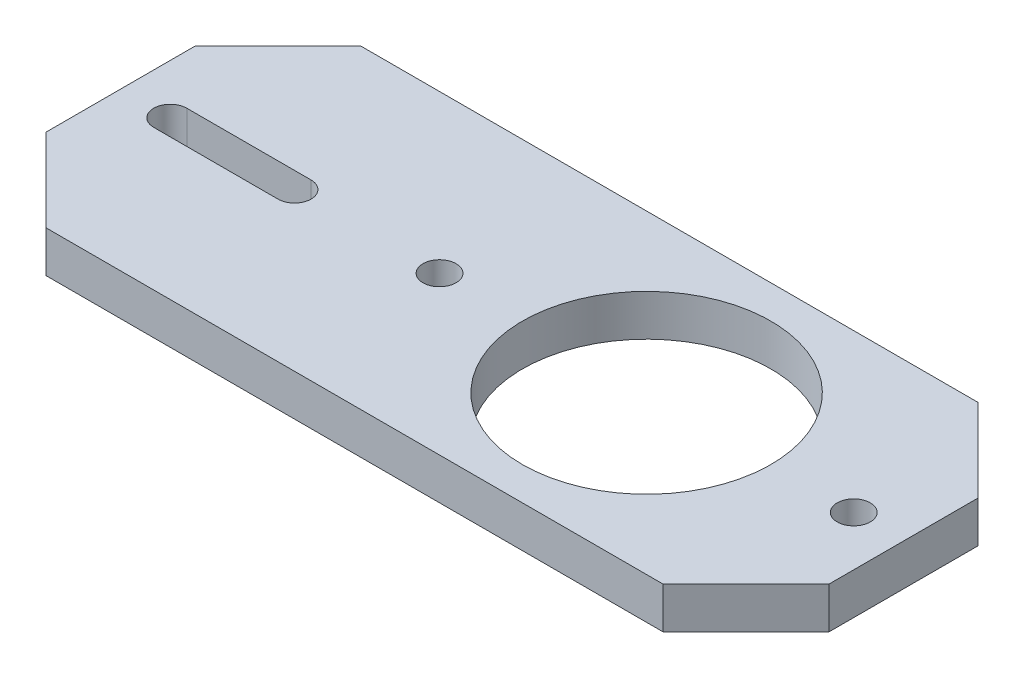
ISO-10303-21;
HEADER;
FILE_DESCRIPTION(('STEP AP214'),'2;1');
FILE_NAME('part.step','',(''),(''),'','','');
FILE_SCHEMA(('AUTOMOTIVE_DESIGN { 1 0 10303 214 1 1 1 1 }'));
ENDSEC;
DATA;
#1=APPLICATION_CONTEXT('core data for automotive mechanical design processes');
#2=APPLICATION_PROTOCOL_DEFINITION('international standard','automotive_design',2000,#1);
#3=PRODUCT_CONTEXT('',#1,'mechanical');
#4=PRODUCT('Part','Part','',(#3));
#5=PRODUCT_RELATED_PRODUCT_CATEGORY('part','',(#4));
#6=PRODUCT_DEFINITION_FORMATION('','',#4);
#7=PRODUCT_DEFINITION_CONTEXT('part definition',#1,'design');
#8=PRODUCT_DEFINITION('design','',#6,#7);
#9=PRODUCT_DEFINITION_SHAPE('','',#8);
#10=(LENGTH_UNIT() NAMED_UNIT(*) SI_UNIT(.MILLI.,.METRE.));
#11=(NAMED_UNIT(*) PLANE_ANGLE_UNIT() SI_UNIT($,.RADIAN.));
#12=(NAMED_UNIT(*) SI_UNIT($,.STERADIAN.) SOLID_ANGLE_UNIT());
#13=UNCERTAINTY_MEASURE_WITH_UNIT(LENGTH_MEASURE(1.E-05),#10,'distance_accuracy_value','');
#14=(GEOMETRIC_REPRESENTATION_CONTEXT(3) GLOBAL_UNCERTAINTY_ASSIGNED_CONTEXT((#13)) GLOBAL_UNIT_ASSIGNED_CONTEXT((#10,
#11,#12)) REPRESENTATION_CONTEXT('',''));
#15=CARTESIAN_POINT('',(0.,0.,0.));
#16=DIRECTION('',(0.,0.,1.));
#17=DIRECTION('',(1.,0.,0.));
#18=AXIS2_PLACEMENT_3D('',#15,#16,#17);
#19=CARTESIAN_POINT('',(-53.5,-5.,-19.));
#20=DIRECTION('',(0.,0.,-1.));
#21=DIRECTION('',(-1.,0.,0.));
#22=AXIS2_PLACEMENT_3D('',#19,#20,#21);
#23=PLANE('',#22);
#24=DIRECTION('',(-1.,0.,0.));
#25=VECTOR('',#24,1.);
#26=CARTESIAN_POINT('',(-53.5,0.,-19.));
#27=LINE('',#26,#25);
#28=CARTESIAN_POINT('',(21.,0.,-19.));
#29=VERTEX_POINT('',#28);
#30=CARTESIAN_POINT('',(-53.5,0.,-19.));
#31=VERTEX_POINT('',#30);
#32=EDGE_CURVE('E176',#29,#31,#27,.T.);
#33=ORIENTED_EDGE('',*,*,#32,.F.);
#34=DIRECTION('',(0.,1.,0.));
#35=VECTOR('',#34,1.);
#36=CARTESIAN_POINT('',(21.,-5.,-19.));
#37=LINE('',#36,#35);
#38=CARTESIAN_POINT('',(21.,-5.,-19.));
#39=VERTEX_POINT('',#38);
#40=EDGE_CURVE('E11',#39,#29,#37,.T.);
#41=ORIENTED_EDGE('',*,*,#40,.F.);
#42=DIRECTION('',(-1.,0.,0.));
#43=VECTOR('',#42,1.);
#44=CARTESIAN_POINT('',(-53.5,-5.,-19.));
#45=LINE('',#44,#43);
#46=CARTESIAN_POINT('',(-53.5,-5.,-19.));
#47=VERTEX_POINT('',#46);
#48=EDGE_CURVE('E179',#39,#47,#45,.T.);
#49=ORIENTED_EDGE('',*,*,#48,.T.);
#50=DIRECTION('',(0.,1.,0.));
#51=VECTOR('',#50,1.);
#52=CARTESIAN_POINT('',(-53.5,-5.,-19.));
#53=LINE('',#52,#51);
#54=EDGE_CURVE('E38',#47,#31,#53,.T.);
#55=ORIENTED_EDGE('',*,*,#54,.T.);
#56=EDGE_LOOP('',(#33,#41,#49,#55));
#57=FACE_BOUND('',#56,.T.);
#58=ADVANCED_FACE('F35',(#57),#23,.T.);
#59=CARTESIAN_POINT('',(21.,-5.,-19.));
#60=DIRECTION('',(0.707106781186547,0.,-0.707106781186548));
#61=DIRECTION('',(-0.707106781186548,0.,-0.707106781186547));
#62=AXIS2_PLACEMENT_3D('',#59,#60,#61);
#63=PLANE('',#62);
#64=DIRECTION('',(-0.707106781186548,0.,-0.707106781186547));
#65=VECTOR('',#64,1.);
#66=CARTESIAN_POINT('',(21.,0.,-19.));
#67=LINE('',#66,#65);
#68=CARTESIAN_POINT('',(31.,0.,-9.));
#69=VERTEX_POINT('',#68);
#70=EDGE_CURVE('E183',#69,#29,#67,.T.);
#71=ORIENTED_EDGE('',*,*,#70,.F.);
#72=DIRECTION('',(0.,1.,0.));
#73=VECTOR('',#72,1.);
#74=CARTESIAN_POINT('',(31.,-5.,-9.));
#75=LINE('',#74,#73);
#76=CARTESIAN_POINT('',(31.,-5.,-9.));
#77=VERTEX_POINT('',#76);
#78=EDGE_CURVE('E43',#77,#69,#75,.T.);
#79=ORIENTED_EDGE('',*,*,#78,.F.);
#80=DIRECTION('',(-0.707106781186548,0.,-0.707106781186547));
#81=VECTOR('',#80,1.);
#82=CARTESIAN_POINT('',(21.,-5.,-19.));
#83=LINE('',#82,#81);
#84=EDGE_CURVE('E201',#77,#39,#83,.T.);
#85=ORIENTED_EDGE('',*,*,#84,.T.);
#86=ORIENTED_EDGE('',*,*,#40,.T.);
#87=EDGE_LOOP('',(#71,#79,#85,#86));
#88=FACE_BOUND('',#87,.T.);
#89=ADVANCED_FACE('F248',(#88),#63,.T.);
#90=CARTESIAN_POINT('',(31.,-5.,-9.));
#91=DIRECTION('',(1.,0.,0.));
#92=DIRECTION('',(0.,0.,-1.));
#93=AXIS2_PLACEMENT_3D('',#90,#91,#92);
#94=PLANE('',#93);
#95=DIRECTION('',(0.,0.,-1.));
#96=VECTOR('',#95,1.);
#97=CARTESIAN_POINT('',(31.,0.,-9.));
#98=LINE('',#97,#96);
#99=CARTESIAN_POINT('',(31.,0.,9.));
#100=VERTEX_POINT('',#99);
#101=EDGE_CURVE('E221',#100,#69,#98,.T.);
#102=ORIENTED_EDGE('',*,*,#101,.F.);
#103=DIRECTION('',(0.,1.,0.));
#104=VECTOR('',#103,1.);
#105=CARTESIAN_POINT('',(31.,-5.,9.));
#106=LINE('',#105,#104);
#107=CARTESIAN_POINT('',(31.,-5.,9.));
#108=VERTEX_POINT('',#107);
#109=EDGE_CURVE('E227',#108,#100,#106,.T.);
#110=ORIENTED_EDGE('',*,*,#109,.F.);
#111=DIRECTION('',(0.,0.,-1.));
#112=VECTOR('',#111,1.);
#113=CARTESIAN_POINT('',(31.,-5.,-9.));
#114=LINE('',#113,#112);
#115=EDGE_CURVE('E198',#108,#77,#114,.T.);
#116=ORIENTED_EDGE('',*,*,#115,.T.);
#117=ORIENTED_EDGE('',*,*,#78,.T.);
#118=EDGE_LOOP('',(#102,#110,#116,#117));
#119=FACE_BOUND('',#118,.T.);
#120=ADVANCED_FACE('F268',(#119),#94,.T.);
#121=CARTESIAN_POINT('',(21.,-5.,19.));
#122=DIRECTION('',(0.707106781186547,0.,0.707106781186548));
#123=DIRECTION('',(0.707106781186548,0.,-0.707106781186547));
#124=AXIS2_PLACEMENT_3D('',#121,#122,#123);
#125=PLANE('',#124);
#126=DIRECTION('',(0.707106781186548,0.,-0.707106781186547));
#127=VECTOR('',#126,1.);
#128=CARTESIAN_POINT('',(21.,0.,19.));
#129=LINE('',#128,#127);
#130=CARTESIAN_POINT('',(21.,0.,19.));
#131=VERTEX_POINT('',#130);
#132=EDGE_CURVE('E218',#131,#100,#129,.T.);
#133=ORIENTED_EDGE('',*,*,#132,.F.);
#134=DIRECTION('',(0.,1.,0.));
#135=VECTOR('',#134,1.);
#136=CARTESIAN_POINT('',(21.,-5.,19.));
#137=LINE('',#136,#135);
#138=CARTESIAN_POINT('',(21.,-5.,19.));
#139=VERTEX_POINT('',#138);
#140=EDGE_CURVE('E229',#139,#131,#137,.T.);
#141=ORIENTED_EDGE('',*,*,#140,.F.);
#142=DIRECTION('',(0.707106781186548,0.,-0.707106781186547));
#143=VECTOR('',#142,1.);
#144=CARTESIAN_POINT('',(21.,-5.,19.));
#145=LINE('',#144,#143);
#146=EDGE_CURVE('E195',#139,#108,#145,.T.);
#147=ORIENTED_EDGE('',*,*,#146,.T.);
#148=ORIENTED_EDGE('',*,*,#109,.T.);
#149=EDGE_LOOP('',(#133,#141,#147,#148));
#150=FACE_BOUND('',#149,.T.);
#151=ADVANCED_FACE('F266',(#150),#125,.T.);
#152=CARTESIAN_POINT('',(-53.5,-5.,19.));
#153=DIRECTION('',(0.,0.,1.));
#154=DIRECTION('',(1.,0.,0.));
#155=AXIS2_PLACEMENT_3D('',#152,#153,#154);
#156=PLANE('',#155);
#157=DIRECTION('',(1.,0.,0.));
#158=VECTOR('',#157,1.);
#159=CARTESIAN_POINT('',(-53.5,0.,19.));
#160=LINE('',#159,#158);
#161=CARTESIAN_POINT('',(-53.5,0.,19.));
#162=VERTEX_POINT('',#161);
#163=EDGE_CURVE('E215',#162,#131,#160,.T.);
#164=ORIENTED_EDGE('',*,*,#163,.F.);
#165=DIRECTION('',(0.,1.,0.));
#166=VECTOR('',#165,1.);
#167=CARTESIAN_POINT('',(-53.5,-5.,19.));
#168=LINE('',#167,#166);
#169=CARTESIAN_POINT('',(-53.5,-5.,19.));
#170=VERTEX_POINT('',#169);
#171=EDGE_CURVE('E231',#170,#162,#168,.T.);
#172=ORIENTED_EDGE('',*,*,#171,.F.);
#173=DIRECTION('',(1.,0.,0.));
#174=VECTOR('',#173,1.);
#175=CARTESIAN_POINT('',(-53.5,-5.,19.));
#176=LINE('',#175,#174);
#177=EDGE_CURVE('E192',#170,#139,#176,.T.);
#178=ORIENTED_EDGE('',*,*,#177,.T.);
#179=ORIENTED_EDGE('',*,*,#140,.T.);
#180=EDGE_LOOP('',(#164,#172,#178,#179));
#181=FACE_BOUND('',#180,.T.);
#182=ADVANCED_FACE('F262',(#181),#156,.T.);
#183=CARTESIAN_POINT('',(-63.5,-5.,9.));
#184=DIRECTION('',(-0.707106781186548,0.,0.707106781186547));
#185=DIRECTION('',(0.707106781186547,0.,0.707106781186548));
#186=AXIS2_PLACEMENT_3D('',#183,#184,#185);
#187=PLANE('',#186);
#188=DIRECTION('',(0.707106781186547,0.,0.707106781186548));
#189=VECTOR('',#188,1.);
#190=CARTESIAN_POINT('',(-63.5,0.,9.));
#191=LINE('',#190,#189);
#192=CARTESIAN_POINT('',(-63.5,0.,9.));
#193=VERTEX_POINT('',#192);
#194=EDGE_CURVE('E212',#193,#162,#191,.T.);
#195=ORIENTED_EDGE('',*,*,#194,.F.);
#196=DIRECTION('',(0.,1.,0.));
#197=VECTOR('',#196,1.);
#198=CARTESIAN_POINT('',(-63.5,-5.,9.));
#199=LINE('',#198,#197);
#200=CARTESIAN_POINT('',(-63.5,-5.,9.));
#201=VERTEX_POINT('',#200);
#202=EDGE_CURVE('E233',#201,#193,#199,.T.);
#203=ORIENTED_EDGE('',*,*,#202,.F.);
#204=DIRECTION('',(0.707106781186547,0.,0.707106781186548));
#205=VECTOR('',#204,1.);
#206=CARTESIAN_POINT('',(-63.5,-5.,9.));
#207=LINE('',#206,#205);
#208=EDGE_CURVE('E189',#201,#170,#207,.T.);
#209=ORIENTED_EDGE('',*,*,#208,.T.);
#210=ORIENTED_EDGE('',*,*,#171,.T.);
#211=EDGE_LOOP('',(#195,#203,#209,#210));
#212=FACE_BOUND('',#211,.T.);
#213=ADVANCED_FACE('F260',(#212),#187,.T.);
#214=CARTESIAN_POINT('',(-63.5,-5.,-9.));
#215=DIRECTION('',(-1.,0.,0.));
#216=DIRECTION('',(0.,0.,1.));
#217=AXIS2_PLACEMENT_3D('',#214,#215,#216);
#218=PLANE('',#217);
#219=DIRECTION('',(0.,0.,1.));
#220=VECTOR('',#219,1.);
#221=CARTESIAN_POINT('',(-63.5,0.,-9.));
#222=LINE('',#221,#220);
#223=CARTESIAN_POINT('',(-63.5,0.,-9.));
#224=VERTEX_POINT('',#223);
#225=EDGE_CURVE('E209',#224,#193,#222,.T.);
#226=ORIENTED_EDGE('',*,*,#225,.F.);
#227=DIRECTION('',(0.,1.,0.));
#228=VECTOR('',#227,1.);
#229=CARTESIAN_POINT('',(-63.5,-5.,-9.));
#230=LINE('',#229,#228);
#231=CARTESIAN_POINT('',(-63.5,-5.,-9.));
#232=VERTEX_POINT('',#231);
#233=EDGE_CURVE('E234',#232,#224,#230,.T.);
#234=ORIENTED_EDGE('',*,*,#233,.F.);
#235=DIRECTION('',(0.,0.,1.));
#236=VECTOR('',#235,1.);
#237=CARTESIAN_POINT('',(-63.5,-5.,-9.));
#238=LINE('',#237,#236);
#239=EDGE_CURVE('E186',#232,#201,#238,.T.);
#240=ORIENTED_EDGE('',*,*,#239,.T.);
#241=ORIENTED_EDGE('',*,*,#202,.T.);
#242=EDGE_LOOP('',(#226,#234,#240,#241));
#243=FACE_BOUND('',#242,.T.);
#244=ADVANCED_FACE('F256',(#243),#218,.T.);
#245=CARTESIAN_POINT('',(-63.5,-5.,-9.));
#246=DIRECTION('',(-0.707106781186548,0.,-0.707106781186548));
#247=DIRECTION('',(-0.707106781186548,0.,0.707106781186548));
#248=AXIS2_PLACEMENT_3D('',#245,#246,#247);
#249=PLANE('',#248);
#250=DIRECTION('',(-0.707106781186548,0.,0.707106781186548));
#251=VECTOR('',#250,1.);
#252=CARTESIAN_POINT('',(-63.5,0.,-9.));
#253=LINE('',#252,#251);
#254=EDGE_CURVE('E206',#31,#224,#253,.T.);
#255=ORIENTED_EDGE('',*,*,#254,.F.);
#256=ORIENTED_EDGE('',*,*,#54,.F.);
#257=DIRECTION('',(-0.707106781186548,0.,0.707106781186548));
#258=VECTOR('',#257,1.);
#259=CARTESIAN_POINT('',(-63.5,-5.,-9.));
#260=LINE('',#259,#258);
#261=EDGE_CURVE('E182',#47,#232,#260,.T.);
#262=ORIENTED_EDGE('',*,*,#261,.T.);
#263=ORIENTED_EDGE('',*,*,#233,.T.);
#264=EDGE_LOOP('',(#255,#256,#262,#263));
#265=FACE_BOUND('',#264,.T.);
#266=ADVANCED_FACE('F242',(#265),#249,.T.);
#267=CARTESIAN_POINT('',(0.,-5.,0.));
#268=DIRECTION('',(0.,-1.,0.));
#269=DIRECTION('',(0.,0.,-1.));
#270=AXIS2_PLACEMENT_3D('',#267,#268,#269);
#271=PLANE('',#270);
#272=CARTESIAN_POINT('',(-57.5,-5.,0.));
#273=DIRECTION('',(0.,1.,0.));
#274=DIRECTION('',(0.,0.,1.));
#275=AXIS2_PLACEMENT_3D('',#272,#273,#274);
#276=CIRCLE('',#275,2.);
#277=CARTESIAN_POINT('',(-57.5,-5.,-2.));
#278=VERTEX_POINT('',#277);
#279=CARTESIAN_POINT('',(-57.5,-5.,2.));
#280=VERTEX_POINT('',#279);
#281=EDGE_CURVE('E126',#278,#280,#276,.T.);
#282=ORIENTED_EDGE('',*,*,#281,.T.);
#283=DIRECTION('',(1.,0.,0.));
#284=VECTOR('',#283,1.);
#285=CARTESIAN_POINT('',(-57.5,-5.,2.));
#286=LINE('',#285,#284);
#287=CARTESIAN_POINT('',(-42.5,-5.,2.));
#288=VERTEX_POINT('',#287);
#289=EDGE_CURVE('E135',#280,#288,#286,.T.);
#290=ORIENTED_EDGE('',*,*,#289,.T.);
#291=CARTESIAN_POINT('',(-42.5,-5.,0.));
#292=DIRECTION('',(0.,1.,0.));
#293=DIRECTION('',(0.,0.,1.));
#294=AXIS2_PLACEMENT_3D('',#291,#292,#293);
#295=CIRCLE('',#294,2.);
#296=CARTESIAN_POINT('',(-42.5,-5.,-2.));
#297=VERTEX_POINT('',#296);
#298=EDGE_CURVE('E51',#288,#297,#295,.T.);
#299=ORIENTED_EDGE('',*,*,#298,.T.);
#300=DIRECTION('',(-1.,0.,0.));
#301=VECTOR('',#300,1.);
#302=CARTESIAN_POINT('',(-57.5,-5.,-2.));
#303=LINE('',#302,#301);
#304=EDGE_CURVE('E132',#297,#278,#303,.T.);
#305=ORIENTED_EDGE('',*,*,#304,.T.);
#306=EDGE_LOOP('',(#282,#290,#299,#305));
#307=FACE_BOUND('',#306,.T.);
#308=CARTESIAN_POINT('',(0.,-5.,0.));
#309=DIRECTION('',(0.,1.,0.));
#310=DIRECTION('',(0.,0.,1.));
#311=AXIS2_PLACEMENT_3D('',#308,#309,#310);
#312=CIRCLE('',#311,15.);
#313=CARTESIAN_POINT('',(0.,-5.,15.));
#314=VERTEX_POINT('',#313);
#315=EDGE_CURVE('E161',#314,#314,#312,.T.);
#316=ORIENTED_EDGE('',*,*,#315,.T.);
#317=EDGE_LOOP('',(#316));
#318=FACE_BOUND('',#317,.T.);
#319=CARTESIAN_POINT('',(25.,-5.,0.));
#320=DIRECTION('',(0.,1.,0.));
#321=DIRECTION('',(0.,0.,1.));
#322=AXIS2_PLACEMENT_3D('',#319,#320,#321);
#323=CIRCLE('',#322,2.);
#324=CARTESIAN_POINT('',(25.,-5.,2.));
#325=VERTEX_POINT('',#324);
#326=EDGE_CURVE('E167',#325,#325,#323,.T.);
#327=ORIENTED_EDGE('',*,*,#326,.T.);
#328=EDGE_LOOP('',(#327));
#329=FACE_BOUND('',#328,.T.);
#330=CARTESIAN_POINT('',(-25.,-5.,0.));
#331=DIRECTION('',(0.,1.,0.));
#332=DIRECTION('',(0.,0.,1.));
#333=AXIS2_PLACEMENT_3D('',#330,#331,#332);
#334=CIRCLE('',#333,2.);
#335=CARTESIAN_POINT('',(-25.,-5.,2.));
#336=VERTEX_POINT('',#335);
#337=EDGE_CURVE('E173',#336,#336,#334,.T.);
#338=ORIENTED_EDGE('',*,*,#337,.T.);
#339=EDGE_LOOP('',(#338));
#340=FACE_BOUND('',#339,.T.);
#341=ORIENTED_EDGE('',*,*,#48,.F.);
#342=ORIENTED_EDGE('',*,*,#84,.F.);
#343=ORIENTED_EDGE('',*,*,#115,.F.);
#344=ORIENTED_EDGE('',*,*,#146,.F.);
#345=ORIENTED_EDGE('',*,*,#177,.F.);
#346=ORIENTED_EDGE('',*,*,#208,.F.);
#347=ORIENTED_EDGE('',*,*,#239,.F.);
#348=ORIENTED_EDGE('',*,*,#261,.F.);
#349=EDGE_LOOP('',(#341,#342,#343,#344,#345,#346,#347,#348));
#350=FACE_BOUND('',#349,.T.);
#351=ADVANCED_FACE('F139',(#307,#318,#329,#340,#350),#271,.T.);
#352=CARTESIAN_POINT('',(0.,0.,0.));
#353=DIRECTION('',(0.,-1.,0.));
#354=DIRECTION('',(0.,0.,-1.));
#355=AXIS2_PLACEMENT_3D('',#352,#353,#354);
#356=PLANE('',#355);
#357=DIRECTION('',(1.,0.,0.));
#358=VECTOR('',#357,1.);
#359=CARTESIAN_POINT('',(-57.5,0.,2.));
#360=LINE('',#359,#358);
#361=CARTESIAN_POINT('',(-57.5,0.,2.));
#362=VERTEX_POINT('',#361);
#363=CARTESIAN_POINT('',(-42.5,0.,2.));
#364=VERTEX_POINT('',#363);
#365=EDGE_CURVE('E151',#362,#364,#360,.T.);
#366=ORIENTED_EDGE('',*,*,#365,.F.);
#367=CARTESIAN_POINT('',(-57.5,0.,0.));
#368=DIRECTION('',(0.,1.,0.));
#369=DIRECTION('',(0.,0.,1.));
#370=AXIS2_PLACEMENT_3D('',#367,#368,#369);
#371=CIRCLE('',#370,2.);
#372=CARTESIAN_POINT('',(-57.5,0.,-2.));
#373=VERTEX_POINT('',#372);
#374=EDGE_CURVE('E59',#373,#362,#371,.T.);
#375=ORIENTED_EDGE('',*,*,#374,.F.);
#376=DIRECTION('',(-1.,0.,0.));
#377=VECTOR('',#376,1.);
#378=CARTESIAN_POINT('',(-57.5,0.,-2.));
#379=LINE('',#378,#377);
#380=CARTESIAN_POINT('',(-42.5,0.,-2.));
#381=VERTEX_POINT('',#380);
#382=EDGE_CURVE('E142',#381,#373,#379,.T.);
#383=ORIENTED_EDGE('',*,*,#382,.F.);
#384=CARTESIAN_POINT('',(-42.5,0.,0.));
#385=DIRECTION('',(0.,1.,0.));
#386=DIRECTION('',(0.,0.,1.));
#387=AXIS2_PLACEMENT_3D('',#384,#385,#386);
#388=CIRCLE('',#387,2.);
#389=EDGE_CURVE('E145',#364,#381,#388,.T.);
#390=ORIENTED_EDGE('',*,*,#389,.F.);
#391=EDGE_LOOP('',(#366,#375,#383,#390));
#392=FACE_BOUND('',#391,.T.);
#393=CARTESIAN_POINT('',(0.,0.,0.));
#394=DIRECTION('',(0.,1.,0.));
#395=DIRECTION('',(0.,0.,1.));
#396=AXIS2_PLACEMENT_3D('',#393,#394,#395);
#397=CIRCLE('',#396,15.);
#398=CARTESIAN_POINT('',(0.,0.,15.));
#399=VERTEX_POINT('',#398);
#400=EDGE_CURVE('E157',#399,#399,#397,.T.);
#401=ORIENTED_EDGE('',*,*,#400,.F.);
#402=EDGE_LOOP('',(#401));
#403=FACE_BOUND('',#402,.T.);
#404=CARTESIAN_POINT('',(25.,0.,0.));
#405=DIRECTION('',(0.,1.,0.));
#406=DIRECTION('',(0.,0.,1.));
#407=AXIS2_PLACEMENT_3D('',#404,#405,#406);
#408=CIRCLE('',#407,2.);
#409=CARTESIAN_POINT('',(25.,0.,2.));
#410=VERTEX_POINT('',#409);
#411=EDGE_CURVE('E164',#410,#410,#408,.T.);
#412=ORIENTED_EDGE('',*,*,#411,.F.);
#413=EDGE_LOOP('',(#412));
#414=FACE_BOUND('',#413,.T.);
#415=CARTESIAN_POINT('',(-25.,0.,0.));
#416=DIRECTION('',(0.,1.,0.));
#417=DIRECTION('',(0.,0.,1.));
#418=AXIS2_PLACEMENT_3D('',#415,#416,#417);
#419=CIRCLE('',#418,2.);
#420=CARTESIAN_POINT('',(-25.,0.,2.));
#421=VERTEX_POINT('',#420);
#422=EDGE_CURVE('E170',#421,#421,#419,.T.);
#423=ORIENTED_EDGE('',*,*,#422,.F.);
#424=EDGE_LOOP('',(#423));
#425=FACE_BOUND('',#424,.T.);
#426=ORIENTED_EDGE('',*,*,#32,.T.);
#427=ORIENTED_EDGE('',*,*,#254,.T.);
#428=ORIENTED_EDGE('',*,*,#225,.T.);
#429=ORIENTED_EDGE('',*,*,#194,.T.);
#430=ORIENTED_EDGE('',*,*,#163,.T.);
#431=ORIENTED_EDGE('',*,*,#132,.T.);
#432=ORIENTED_EDGE('',*,*,#101,.T.);
#433=ORIENTED_EDGE('',*,*,#70,.T.);
#434=EDGE_LOOP('',(#426,#427,#428,#429,#430,#431,#432,#433));
#435=FACE_BOUND('',#434,.T.);
#436=ADVANCED_FACE('F244',(#392,#403,#414,#425,#435),#356,.F.);
#437=CARTESIAN_POINT('',(-25.,-5.,0.));
#438=DIRECTION('',(0.,1.,0.));
#439=DIRECTION('',(0.,0.,1.));
#440=AXIS2_PLACEMENT_3D('',#437,#438,#439);
#441=CYLINDRICAL_SURFACE('',#440,2.);
#442=ORIENTED_EDGE('',*,*,#337,.F.);
#443=EDGE_LOOP('',(#442));
#444=FACE_BOUND('',#443,.T.);
#445=ORIENTED_EDGE('',*,*,#422,.T.);
#446=EDGE_LOOP('',(#445));
#447=FACE_BOUND('',#446,.T.);
#448=ADVANCED_FACE('F344',(#444,#447),#441,.F.);
#449=CARTESIAN_POINT('',(25.,-5.,0.));
#450=DIRECTION('',(0.,1.,0.));
#451=DIRECTION('',(0.,0.,1.));
#452=AXIS2_PLACEMENT_3D('',#449,#450,#451);
#453=CYLINDRICAL_SURFACE('',#452,2.);
#454=ORIENTED_EDGE('',*,*,#326,.F.);
#455=EDGE_LOOP('',(#454));
#456=FACE_BOUND('',#455,.T.);
#457=ORIENTED_EDGE('',*,*,#411,.T.);
#458=EDGE_LOOP('',(#457));
#459=FACE_BOUND('',#458,.T.);
#460=ADVANCED_FACE('F354',(#456,#459),#453,.F.);
#461=CARTESIAN_POINT('',(0.,-5.,0.));
#462=DIRECTION('',(0.,1.,0.));
#463=DIRECTION('',(0.,0.,1.));
#464=AXIS2_PLACEMENT_3D('',#461,#462,#463);
#465=CYLINDRICAL_SURFACE('',#464,15.);
#466=ORIENTED_EDGE('',*,*,#315,.F.);
#467=EDGE_LOOP('',(#466));
#468=FACE_BOUND('',#467,.T.);
#469=ORIENTED_EDGE('',*,*,#400,.T.);
#470=EDGE_LOOP('',(#469));
#471=FACE_BOUND('',#470,.T.);
#472=ADVANCED_FACE('F364',(#468,#471),#465,.F.);
#473=CARTESIAN_POINT('',(-57.5,-5.,0.));
#474=DIRECTION('',(0.,1.,0.));
#475=DIRECTION('',(0.,0.,1.));
#476=AXIS2_PLACEMENT_3D('',#473,#474,#475);
#477=CYLINDRICAL_SURFACE('',#476,2.);
#478=ORIENTED_EDGE('',*,*,#374,.T.);
#479=DIRECTION('',(0.,1.,0.));
#480=VECTOR('',#479,1.);
#481=CARTESIAN_POINT('',(-57.5,-5.,2.));
#482=LINE('',#481,#480);
#483=EDGE_CURVE('E122',#280,#362,#482,.T.);
#484=ORIENTED_EDGE('',*,*,#483,.F.);
#485=ORIENTED_EDGE('',*,*,#281,.F.);
#486=DIRECTION('',(0.,1.,0.));
#487=VECTOR('',#486,1.);
#488=CARTESIAN_POINT('',(-57.5,-5.,-2.));
#489=LINE('',#488,#487);
#490=EDGE_CURVE('E155',#278,#373,#489,.T.);
#491=ORIENTED_EDGE('',*,*,#490,.T.);
#492=EDGE_LOOP('',(#478,#484,#485,#491));
#493=FACE_BOUND('',#492,.T.);
#494=ADVANCED_FACE('F124',(#493),#477,.F.);
#495=CARTESIAN_POINT('',(-57.5,-5.,-2.));
#496=DIRECTION('',(0.,0.,-1.));
#497=DIRECTION('',(-1.,0.,0.));
#498=AXIS2_PLACEMENT_3D('',#495,#496,#497);
#499=PLANE('',#498);
#500=ORIENTED_EDGE('',*,*,#382,.T.);
#501=ORIENTED_EDGE('',*,*,#490,.F.);
#502=ORIENTED_EDGE('',*,*,#304,.F.);
#503=DIRECTION('',(0.,1.,0.));
#504=VECTOR('',#503,1.);
#505=CARTESIAN_POINT('',(-42.5,-5.,-2.));
#506=LINE('',#505,#504);
#507=EDGE_CURVE('E158',#297,#381,#506,.T.);
#508=ORIENTED_EDGE('',*,*,#507,.T.);
#509=EDGE_LOOP('',(#500,#501,#502,#508));
#510=FACE_BOUND('',#509,.T.);
#511=ADVANCED_FACE('F383',(#510),#499,.F.);
#512=CARTESIAN_POINT('',(-42.5,-5.,0.));
#513=DIRECTION('',(0.,1.,0.));
#514=DIRECTION('',(0.,0.,1.));
#515=AXIS2_PLACEMENT_3D('',#512,#513,#514);
#516=CYLINDRICAL_SURFACE('',#515,2.);
#517=ORIENTED_EDGE('',*,*,#389,.T.);
#518=ORIENTED_EDGE('',*,*,#507,.F.);
#519=ORIENTED_EDGE('',*,*,#298,.F.);
#520=DIRECTION('',(0.,1.,0.));
#521=VECTOR('',#520,1.);
#522=CARTESIAN_POINT('',(-42.5,-5.,2.));
#523=LINE('',#522,#521);
#524=EDGE_CURVE('E131',#288,#364,#523,.T.);
#525=ORIENTED_EDGE('',*,*,#524,.T.);
#526=EDGE_LOOP('',(#517,#518,#519,#525));
#527=FACE_BOUND('',#526,.T.);
#528=ADVANCED_FACE('F392',(#527),#516,.F.);
#529=CARTESIAN_POINT('',(-57.5,-5.,2.));
#530=DIRECTION('',(0.,0.,1.));
#531=DIRECTION('',(1.,0.,0.));
#532=AXIS2_PLACEMENT_3D('',#529,#530,#531);
#533=PLANE('',#532);
#534=ORIENTED_EDGE('',*,*,#365,.T.);
#535=ORIENTED_EDGE('',*,*,#524,.F.);
#536=ORIENTED_EDGE('',*,*,#289,.F.);
#537=ORIENTED_EDGE('',*,*,#483,.T.);
#538=EDGE_LOOP('',(#534,#535,#536,#537));
#539=FACE_BOUND('',#538,.T.);
#540=ADVANCED_FACE('F136',(#539),#533,.F.);
#541=CLOSED_SHELL('',(#58,#89,#120,#151,#182,#213,#244,#266,#351,#436,#448,#460,#472,#494,#511,
#528,#540));
#542=MANIFOLD_SOLID_BREP('B2',#541);
#543=ADVANCED_BREP_SHAPE_REPRESENTATION('',(#18,#542),#14);
#544=SHAPE_DEFINITION_REPRESENTATION(#9,#543);
ENDSEC;
END-ISO-10303-21;
